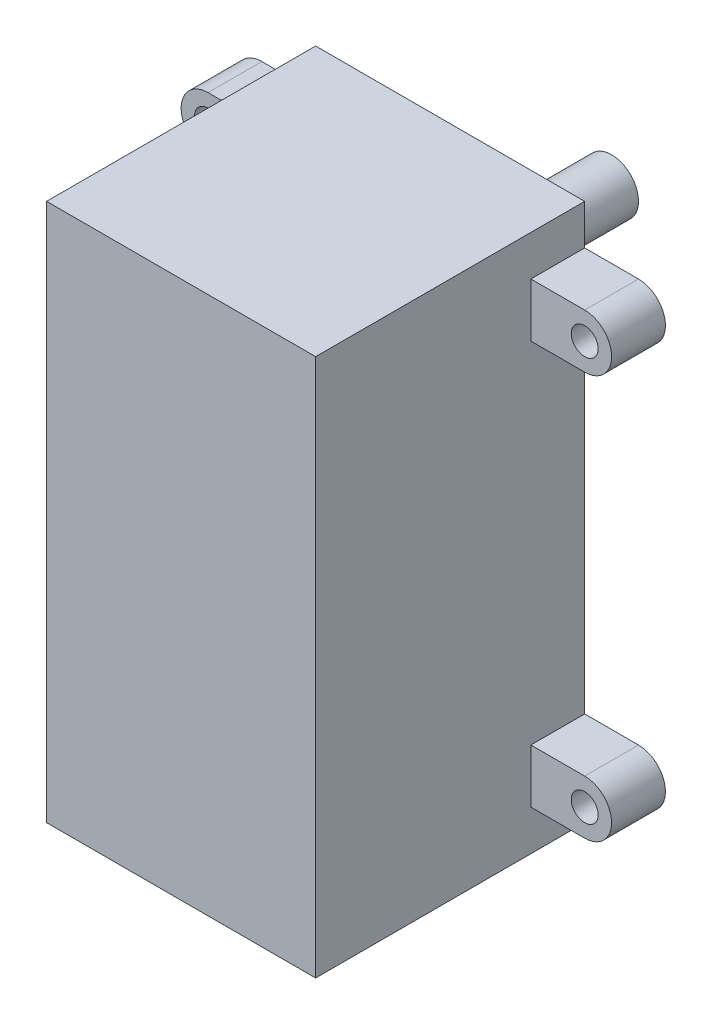
ISO-10303-21;
HEADER;
FILE_DESCRIPTION(('STEP AP214'),'2;1');
FILE_NAME('part.step','',(''),(''),'','','');
FILE_SCHEMA(('AUTOMOTIVE_DESIGN { 1 0 10303 214 1 1 1 1 }'));
ENDSEC;
DATA;
#1=APPLICATION_CONTEXT('core data for automotive mechanical design processes');
#2=APPLICATION_PROTOCOL_DEFINITION('international standard','automotive_design',2000,#1);
#3=PRODUCT_CONTEXT('',#1,'mechanical');
#4=PRODUCT('Part','Part','',(#3));
#5=PRODUCT_RELATED_PRODUCT_CATEGORY('part','',(#4));
#6=PRODUCT_DEFINITION_FORMATION('','',#4);
#7=PRODUCT_DEFINITION_CONTEXT('part definition',#1,'design');
#8=PRODUCT_DEFINITION('design','',#6,#7);
#9=PRODUCT_DEFINITION_SHAPE('','',#8);
#10=(LENGTH_UNIT() NAMED_UNIT(*) SI_UNIT(.MILLI.,.METRE.));
#11=(NAMED_UNIT(*) PLANE_ANGLE_UNIT() SI_UNIT($,.RADIAN.));
#12=(NAMED_UNIT(*) SI_UNIT($,.STERADIAN.) SOLID_ANGLE_UNIT());
#13=UNCERTAINTY_MEASURE_WITH_UNIT(LENGTH_MEASURE(1.E-05),#10,'distance_accuracy_value','');
#14=(GEOMETRIC_REPRESENTATION_CONTEXT(3) GLOBAL_UNCERTAINTY_ASSIGNED_CONTEXT((#13)) GLOBAL_UNIT_ASSIGNED_CONTEXT((#10,
#11,#12)) REPRESENTATION_CONTEXT('',''));
#15=CARTESIAN_POINT('',(0.,0.,0.));
#16=DIRECTION('',(0.,0.,1.));
#17=DIRECTION('',(1.,0.,0.));
#18=AXIS2_PLACEMENT_3D('',#15,#16,#17);
#19=CARTESIAN_POINT('',(-3.29383886255924,-5.,50.));
#20=DIRECTION('',(1.,0.,0.));
#21=DIRECTION('',(0.,0.,-1.));
#22=AXIS2_PLACEMENT_3D('',#19,#20,#21);
#23=PLANE('',#22);
#24=DIRECTION('',(0.,0.,-1.));
#25=VECTOR('',#24,1.);
#26=CARTESIAN_POINT('',(-3.29383886255924,87.5,10.));
#27=LINE('',#26,#25);
#28=CARTESIAN_POINT('',(-3.29383886255924,87.5,10.));
#29=VERTEX_POINT('',#28);
#30=CARTESIAN_POINT('',(-3.29383886255924,87.5,0.));
#31=VERTEX_POINT('',#30);
#32=EDGE_CURVE('E372',#29,#31,#27,.T.);
#33=ORIENTED_EDGE('',*,*,#32,.F.);
#34=DIRECTION('',(0.,-1.,0.));
#35=VECTOR('',#34,1.);
#36=CARTESIAN_POINT('',(-3.29383886255924,77.5,10.));
#37=LINE('',#36,#35);
#38=CARTESIAN_POINT('',(-3.29383886255924,77.5,10.));
#39=VERTEX_POINT('',#38);
#40=EDGE_CURVE('E214',#29,#39,#37,.T.);
#41=ORIENTED_EDGE('',*,*,#40,.T.);
#42=DIRECTION('',(0.,0.,-1.));
#43=VECTOR('',#42,1.);
#44=CARTESIAN_POINT('',(-3.29383886255924,77.5,10.));
#45=LINE('',#44,#43);
#46=CARTESIAN_POINT('',(-3.29383886255924,77.5,0.));
#47=VERTEX_POINT('',#46);
#48=EDGE_CURVE('E189',#39,#47,#45,.T.);
#49=ORIENTED_EDGE('',*,*,#48,.T.);
#50=DIRECTION('',(0.,-1.,0.));
#51=VECTOR('',#50,1.);
#52=CARTESIAN_POINT('',(-3.29383886255924,-5.,0.));
#53=LINE('',#52,#51);
#54=CARTESIAN_POINT('',(-3.29383886255924,12.5,0.));
#55=VERTEX_POINT('',#54);
#56=EDGE_CURVE('E206',#47,#55,#53,.T.);
#57=ORIENTED_EDGE('',*,*,#56,.T.);
#58=DIRECTION('',(0.,0.,-1.));
#59=VECTOR('',#58,1.);
#60=CARTESIAN_POINT('',(-3.29383886255924,12.5,10.));
#61=LINE('',#60,#59);
#62=CARTESIAN_POINT('',(-3.29383886255924,12.5,10.));
#63=VERTEX_POINT('',#62);
#64=EDGE_CURVE('E325',#63,#55,#61,.T.);
#65=ORIENTED_EDGE('',*,*,#64,.F.);
#66=DIRECTION('',(0.,-1.,0.));
#67=VECTOR('',#66,1.);
#68=CARTESIAN_POINT('',(-3.29383886255924,12.5,10.));
#69=LINE('',#68,#67);
#70=CARTESIAN_POINT('',(-3.29383886255924,2.5,10.));
#71=VERTEX_POINT('',#70);
#72=EDGE_CURVE('E304',#63,#71,#69,.T.);
#73=ORIENTED_EDGE('',*,*,#72,.T.);
#74=DIRECTION('',(0.,0.,-1.));
#75=VECTOR('',#74,1.);
#76=CARTESIAN_POINT('',(-3.29383886255924,2.5,10.));
#77=LINE('',#76,#75);
#78=CARTESIAN_POINT('',(-3.29383886255924,2.5,0.));
#79=VERTEX_POINT('',#78);
#80=EDGE_CURVE('E316',#71,#79,#77,.T.);
#81=ORIENTED_EDGE('',*,*,#80,.T.);
#82=CARTESIAN_POINT('',(-3.29383886255924,-5.,0.));
#83=VERTEX_POINT('',#82);
#84=EDGE_CURVE('E344',#79,#83,#53,.T.);
#85=ORIENTED_EDGE('',*,*,#84,.T.);
#86=DIRECTION('',(0.,0.,-1.));
#87=VECTOR('',#86,1.);
#88=CARTESIAN_POINT('',(-3.29383886255924,-5.,50.));
#89=LINE('',#88,#87);
#90=CARTESIAN_POINT('',(-3.29383886255924,-5.,50.));
#91=VERTEX_POINT('',#90);
#92=EDGE_CURVE('E357',#91,#83,#89,.T.);
#93=ORIENTED_EDGE('',*,*,#92,.F.);
#94=DIRECTION('',(0.,-1.,0.));
#95=VECTOR('',#94,1.);
#96=CARTESIAN_POINT('',(-3.29383886255924,-5.,50.));
#97=LINE('',#96,#95);
#98=CARTESIAN_POINT('',(-3.29383886255924,95.,50.));
#99=VERTEX_POINT('',#98);
#100=EDGE_CURVE('E334',#99,#91,#97,.T.);
#101=ORIENTED_EDGE('',*,*,#100,.F.);
#102=DIRECTION('',(0.,0.,-1.));
#103=VECTOR('',#102,1.);
#104=CARTESIAN_POINT('',(-3.29383886255924,95.,50.));
#105=LINE('',#104,#103);
#106=CARTESIAN_POINT('',(-3.29383886255924,95.,0.));
#107=VERTEX_POINT('',#106);
#108=EDGE_CURVE('E50',#99,#107,#105,.T.);
#109=ORIENTED_EDGE('',*,*,#108,.T.);
#110=EDGE_CURVE('E343',#107,#31,#53,.T.);
#111=ORIENTED_EDGE('',*,*,#110,.T.);
#112=EDGE_LOOP('',(#33,#41,#49,#57,#65,#73,#81,#85,#93,#101,#109,#111));
#113=FACE_BOUND('',#112,.T.);
#114=ADVANCED_FACE('F43',(#113),#23,.F.);
#115=CARTESIAN_POINT('',(46.7061611374408,-5.,50.));
#116=DIRECTION('',(-1.,0.,0.));
#117=DIRECTION('',(0.,0.,1.));
#118=AXIS2_PLACEMENT_3D('',#115,#116,#117);
#119=PLANE('',#118);
#120=DIRECTION('',(0.,0.,-1.));
#121=VECTOR('',#120,1.);
#122=CARTESIAN_POINT('',(46.7061611374408,2.5,10.));
#123=LINE('',#122,#121);
#124=CARTESIAN_POINT('',(46.7061611374408,2.5,10.));
#125=VERTEX_POINT('',#124);
#126=CARTESIAN_POINT('',(46.7061611374408,2.5,0.));
#127=VERTEX_POINT('',#126);
#128=EDGE_CURVE('E264',#125,#127,#123,.T.);
#129=ORIENTED_EDGE('',*,*,#128,.F.);
#130=DIRECTION('',(0.,1.,0.));
#131=VECTOR('',#130,1.);
#132=CARTESIAN_POINT('',(46.7061611374408,12.5,10.));
#133=LINE('',#132,#131);
#134=CARTESIAN_POINT('',(46.7061611374408,12.5,10.));
#135=VERTEX_POINT('',#134);
#136=EDGE_CURVE('E286',#125,#135,#133,.T.);
#137=ORIENTED_EDGE('',*,*,#136,.T.);
#138=DIRECTION('',(0.,0.,-1.));
#139=VECTOR('',#138,1.);
#140=CARTESIAN_POINT('',(46.7061611374408,12.5,10.));
#141=LINE('',#140,#139);
#142=CARTESIAN_POINT('',(46.7061611374408,12.5,0.));
#143=VERTEX_POINT('',#142);
#144=EDGE_CURVE('E270',#135,#143,#141,.T.);
#145=ORIENTED_EDGE('',*,*,#144,.T.);
#146=DIRECTION('',(0.,1.,0.));
#147=VECTOR('',#146,1.);
#148=CARTESIAN_POINT('',(46.7061611374408,-5.,0.));
#149=LINE('',#148,#147);
#150=CARTESIAN_POINT('',(46.7061611374408,77.5,0.));
#151=VERTEX_POINT('',#150);
#152=EDGE_CURVE('E354',#143,#151,#149,.T.);
#153=ORIENTED_EDGE('',*,*,#152,.T.);
#154=DIRECTION('',(0.,0.,-1.));
#155=VECTOR('',#154,1.);
#156=CARTESIAN_POINT('',(46.7061611374408,77.5,10.));
#157=LINE('',#156,#155);
#158=CARTESIAN_POINT('',(46.7061611374408,77.5,10.));
#159=VERTEX_POINT('',#158);
#160=EDGE_CURVE('E226',#159,#151,#157,.T.);
#161=ORIENTED_EDGE('',*,*,#160,.F.);
#162=DIRECTION('',(0.,1.,0.));
#163=VECTOR('',#162,1.);
#164=CARTESIAN_POINT('',(46.7061611374408,77.5,10.));
#165=LINE('',#164,#163);
#166=CARTESIAN_POINT('',(46.7061611374408,87.5,10.));
#167=VERTEX_POINT('',#166);
#168=EDGE_CURVE('E250',#159,#167,#165,.T.);
#169=ORIENTED_EDGE('',*,*,#168,.T.);
#170=DIRECTION('',(0.,0.,-1.));
#171=VECTOR('',#170,1.);
#172=CARTESIAN_POINT('',(46.7061611374408,87.5,10.));
#173=LINE('',#172,#171);
#174=CARTESIAN_POINT('',(46.7061611374408,87.5,0.));
#175=VERTEX_POINT('',#174);
#176=EDGE_CURVE('E231',#167,#175,#173,.T.);
#177=ORIENTED_EDGE('',*,*,#176,.T.);
#178=CARTESIAN_POINT('',(46.7061611374408,95.,0.));
#179=VERTEX_POINT('',#178);
#180=EDGE_CURVE('E349',#175,#179,#149,.T.);
#181=ORIENTED_EDGE('',*,*,#180,.T.);
#182=DIRECTION('',(0.,0.,-1.));
#183=VECTOR('',#182,1.);
#184=CARTESIAN_POINT('',(46.7061611374408,95.,50.));
#185=LINE('',#184,#183);
#186=CARTESIAN_POINT('',(46.7061611374408,95.,50.));
#187=VERTEX_POINT('',#186);
#188=EDGE_CURVE('E338',#187,#179,#185,.T.);
#189=ORIENTED_EDGE('',*,*,#188,.F.);
#190=DIRECTION('',(0.,1.,0.));
#191=VECTOR('',#190,1.);
#192=CARTESIAN_POINT('',(46.7061611374408,-5.,50.));
#193=LINE('',#192,#191);
#194=CARTESIAN_POINT('',(46.7061611374408,-5.,50.));
#195=VERTEX_POINT('',#194);
#196=EDGE_CURVE('E340',#195,#187,#193,.T.);
#197=ORIENTED_EDGE('',*,*,#196,.F.);
#198=DIRECTION('',(0.,0.,-1.));
#199=VECTOR('',#198,1.);
#200=CARTESIAN_POINT('',(46.7061611374408,-5.,50.));
#201=LINE('',#200,#199);
#202=CARTESIAN_POINT('',(46.7061611374408,-5.,0.));
#203=VERTEX_POINT('',#202);
#204=EDGE_CURVE('E353',#195,#203,#201,.T.);
#205=ORIENTED_EDGE('',*,*,#204,.T.);
#206=EDGE_CURVE('E331',#203,#127,#149,.T.);
#207=ORIENTED_EDGE('',*,*,#206,.T.);
#208=EDGE_LOOP('',(#129,#137,#145,#153,#161,#169,#177,#181,#189,#197,#205,#207));
#209=FACE_BOUND('',#208,.T.);
#210=ADVANCED_FACE('F410',(#209),#119,.F.);
#211=CARTESIAN_POINT('',(46.7061611374408,95.,50.));
#212=DIRECTION('',(0.,-1.,0.));
#213=DIRECTION('',(0.,0.,-1.));
#214=AXIS2_PLACEMENT_3D('',#211,#212,#213);
#215=PLANE('',#214);
#216=DIRECTION('',(-1.,0.,0.));
#217=VECTOR('',#216,1.);
#218=CARTESIAN_POINT('',(46.7061611374408,95.,0.));
#219=LINE('',#218,#217);
#220=EDGE_CURVE('E322',#179,#107,#219,.T.);
#221=ORIENTED_EDGE('',*,*,#220,.T.);
#222=ORIENTED_EDGE('',*,*,#108,.F.);
#223=DIRECTION('',(-1.,0.,0.));
#224=VECTOR('',#223,1.);
#225=CARTESIAN_POINT('',(46.7061611374408,95.,50.));
#226=LINE('',#225,#224);
#227=EDGE_CURVE('E329',#187,#99,#226,.T.);
#228=ORIENTED_EDGE('',*,*,#227,.F.);
#229=ORIENTED_EDGE('',*,*,#188,.T.);
#230=EDGE_LOOP('',(#221,#222,#228,#229));
#231=FACE_BOUND('',#230,.T.);
#232=ADVANCED_FACE('F44',(#231),#215,.F.);
#233=CARTESIAN_POINT('',(46.7061611374408,-5.,50.));
#234=DIRECTION('',(0.,1.,0.));
#235=DIRECTION('',(0.,0.,1.));
#236=AXIS2_PLACEMENT_3D('',#233,#234,#235);
#237=PLANE('',#236);
#238=DIRECTION('',(1.,0.,0.));
#239=VECTOR('',#238,1.);
#240=CARTESIAN_POINT('',(46.7061611374408,-5.,0.));
#241=LINE('',#240,#239);
#242=EDGE_CURVE('E350',#83,#203,#241,.T.);
#243=ORIENTED_EDGE('',*,*,#242,.T.);
#244=ORIENTED_EDGE('',*,*,#204,.F.);
#245=DIRECTION('',(1.,0.,0.));
#246=VECTOR('',#245,1.);
#247=CARTESIAN_POINT('',(46.7061611374408,-5.,50.));
#248=LINE('',#247,#246);
#249=EDGE_CURVE('E337',#91,#195,#248,.T.);
#250=ORIENTED_EDGE('',*,*,#249,.F.);
#251=ORIENTED_EDGE('',*,*,#92,.T.);
#252=EDGE_LOOP('',(#243,#244,#250,#251));
#253=FACE_BOUND('',#252,.T.);
#254=ADVANCED_FACE('F401',(#253),#237,.F.);
#255=CARTESIAN_POINT('',(0.,0.,50.));
#256=DIRECTION('',(0.,0.,-1.));
#257=DIRECTION('',(-1.,0.,0.));
#258=AXIS2_PLACEMENT_3D('',#255,#256,#257);
#259=PLANE('',#258);
#260=ORIENTED_EDGE('',*,*,#227,.T.);
#261=ORIENTED_EDGE('',*,*,#100,.T.);
#262=ORIENTED_EDGE('',*,*,#249,.T.);
#263=ORIENTED_EDGE('',*,*,#196,.T.);
#264=EDGE_LOOP('',(#260,#261,#262,#263));
#265=FACE_BOUND('',#264,.T.);
#266=ADVANCED_FACE('F394',(#265),#259,.F.);
#267=CARTESIAN_POINT('',(0.,0.,0.));
#268=DIRECTION('',(0.,0.,-1.));
#269=DIRECTION('',(-1.,0.,0.));
#270=AXIS2_PLACEMENT_3D('',#267,#268,#269);
#271=PLANE('',#270);
#272=CARTESIAN_POINT('',(21.7061611374408,70.,0.));
#273=DIRECTION('',(0.,0.,-1.));
#274=DIRECTION('',(-1.,0.,0.));
#275=AXIS2_PLACEMENT_3D('',#272,#273,#274);
#276=CIRCLE('',#275,5.);
#277=CARTESIAN_POINT('',(16.7061611374408,70.,0.));
#278=VERTEX_POINT('',#277);
#279=EDGE_CURVE('E11',#278,#278,#276,.T.);
#280=ORIENTED_EDGE('',*,*,#279,.F.);
#281=EDGE_LOOP('',(#280));
#282=FACE_BOUND('',#281,.T.);
#283=ORIENTED_EDGE('',*,*,#220,.F.);
#284=ORIENTED_EDGE('',*,*,#180,.F.);
#285=DIRECTION('',(1.,0.,0.));
#286=VECTOR('',#285,1.);
#287=CARTESIAN_POINT('',(46.7061611374408,87.5,0.));
#288=LINE('',#287,#286);
#289=CARTESIAN_POINT('',(56.7061611374408,87.5,0.));
#290=VERTEX_POINT('',#289);
#291=EDGE_CURVE('E240',#175,#290,#288,.T.);
#292=ORIENTED_EDGE('',*,*,#291,.T.);
#293=CARTESIAN_POINT('',(56.7061611374408,82.5,0.));
#294=DIRECTION('',(0.,0.,-1.));
#295=DIRECTION('',(-1.,0.,0.));
#296=AXIS2_PLACEMENT_3D('',#293,#294,#295);
#297=CIRCLE('',#296,5.);
#298=CARTESIAN_POINT('',(56.7061611374408,77.5,0.));
#299=VERTEX_POINT('',#298);
#300=EDGE_CURVE('E241',#290,#299,#297,.T.);
#301=ORIENTED_EDGE('',*,*,#300,.T.);
#302=DIRECTION('',(-1.,0.,0.));
#303=VECTOR('',#302,1.);
#304=CARTESIAN_POINT('',(56.7061611374408,77.5,0.));
#305=LINE('',#304,#303);
#306=EDGE_CURVE('E238',#299,#151,#305,.T.);
#307=ORIENTED_EDGE('',*,*,#306,.T.);
#308=ORIENTED_EDGE('',*,*,#152,.F.);
#309=DIRECTION('',(1.,0.,0.));
#310=VECTOR('',#309,1.);
#311=CARTESIAN_POINT('',(56.7061611374408,12.5,0.));
#312=LINE('',#311,#310);
#313=CARTESIAN_POINT('',(56.7061611374408,12.5,0.));
#314=VERTEX_POINT('',#313);
#315=EDGE_CURVE('E272',#143,#314,#312,.T.);
#316=ORIENTED_EDGE('',*,*,#315,.T.);
#317=CARTESIAN_POINT('',(56.7061611374408,7.5,0.));
#318=DIRECTION('',(0.,0.,-1.));
#319=DIRECTION('',(1.,0.,0.));
#320=AXIS2_PLACEMENT_3D('',#317,#318,#319);
#321=CIRCLE('',#320,5.);
#322=CARTESIAN_POINT('',(56.7061611374408,2.5,0.));
#323=VERTEX_POINT('',#322);
#324=EDGE_CURVE('E278',#314,#323,#321,.T.);
#325=ORIENTED_EDGE('',*,*,#324,.T.);
#326=DIRECTION('',(-1.,0.,0.));
#327=VECTOR('',#326,1.);
#328=CARTESIAN_POINT('',(46.7061611374408,2.5,0.));
#329=LINE('',#328,#327);
#330=EDGE_CURVE('E277',#323,#127,#329,.T.);
#331=ORIENTED_EDGE('',*,*,#330,.T.);
#332=ORIENTED_EDGE('',*,*,#206,.F.);
#333=ORIENTED_EDGE('',*,*,#242,.F.);
#334=ORIENTED_EDGE('',*,*,#84,.F.);
#335=DIRECTION('',(-1.,0.,0.));
#336=VECTOR('',#335,1.);
#337=CARTESIAN_POINT('',(-3.29383886255924,2.5,0.));
#338=LINE('',#337,#336);
#339=CARTESIAN_POINT('',(-13.2938388625592,2.5,0.));
#340=VERTEX_POINT('',#339);
#341=EDGE_CURVE('E56',#79,#340,#338,.T.);
#342=ORIENTED_EDGE('',*,*,#341,.T.);
#343=CARTESIAN_POINT('',(-13.2938388625592,7.5,0.));
#344=DIRECTION('',(0.,0.,-1.));
#345=DIRECTION('',(-1.,0.,0.));
#346=AXIS2_PLACEMENT_3D('',#343,#344,#345);
#347=CIRCLE('',#346,5.);
#348=CARTESIAN_POINT('',(-13.2938388625592,12.5,0.));
#349=VERTEX_POINT('',#348);
#350=EDGE_CURVE('E318',#340,#349,#347,.T.);
#351=ORIENTED_EDGE('',*,*,#350,.T.);
#352=DIRECTION('',(1.,0.,0.));
#353=VECTOR('',#352,1.);
#354=CARTESIAN_POINT('',(-13.2938388625592,12.5,0.));
#355=LINE('',#354,#353);
#356=EDGE_CURVE('E307',#349,#55,#355,.T.);
#357=ORIENTED_EDGE('',*,*,#356,.T.);
#358=ORIENTED_EDGE('',*,*,#56,.F.);
#359=DIRECTION('',(-1.,0.,0.));
#360=VECTOR('',#359,1.);
#361=CARTESIAN_POINT('',(-13.2938388625592,77.5,0.));
#362=LINE('',#361,#360);
#363=CARTESIAN_POINT('',(-13.2938388625592,77.5,0.));
#364=VERTEX_POINT('',#363);
#365=EDGE_CURVE('E67',#47,#364,#362,.T.);
#366=ORIENTED_EDGE('',*,*,#365,.T.);
#367=CARTESIAN_POINT('',(-13.2938388625592,82.5,0.));
#368=DIRECTION('',(0.,0.,-1.));
#369=DIRECTION('',(1.,0.,0.));
#370=AXIS2_PLACEMENT_3D('',#367,#368,#369);
#371=CIRCLE('',#370,5.);
#372=CARTESIAN_POINT('',(-13.2938388625592,87.5,0.));
#373=VERTEX_POINT('',#372);
#374=EDGE_CURVE('E191',#364,#373,#371,.T.);
#375=ORIENTED_EDGE('',*,*,#374,.T.);
#376=DIRECTION('',(1.,0.,0.));
#377=VECTOR('',#376,1.);
#378=CARTESIAN_POINT('',(-3.29383886255924,87.5,0.));
#379=LINE('',#378,#377);
#380=EDGE_CURVE('E196',#373,#31,#379,.T.);
#381=ORIENTED_EDGE('',*,*,#380,.T.);
#382=ORIENTED_EDGE('',*,*,#110,.F.);
#383=EDGE_LOOP('',(#283,#284,#292,#301,#307,#308,#316,#325,#331,#332,#333,#334,#342,#351,#357,
#358,#366,#375,#381,#382));
#384=FACE_BOUND('',#383,.T.);
#385=CARTESIAN_POINT('',(56.7061611374408,82.5,0.));
#386=DIRECTION('',(0.,0.,-1.));
#387=DIRECTION('',(-1.,0.,0.));
#388=AXIS2_PLACEMENT_3D('',#385,#386,#387);
#389=CIRCLE('',#388,2.5);
#390=CARTESIAN_POINT('',(54.2061611374408,82.5,0.));
#391=VERTEX_POINT('',#390);
#392=EDGE_CURVE('E190',#391,#391,#389,.T.);
#393=ORIENTED_EDGE('',*,*,#392,.F.);
#394=EDGE_LOOP('',(#393));
#395=FACE_BOUND('',#394,.T.);
#396=CARTESIAN_POINT('',(56.7061611374408,7.5,0.));
#397=DIRECTION('',(0.,0.,-1.));
#398=DIRECTION('',(1.,0.,0.));
#399=AXIS2_PLACEMENT_3D('',#396,#397,#398);
#400=CIRCLE('',#399,2.5);
#401=CARTESIAN_POINT('',(59.2061611374408,7.5,0.));
#402=VERTEX_POINT('',#401);
#403=EDGE_CURVE('E237',#402,#402,#400,.T.);
#404=ORIENTED_EDGE('',*,*,#403,.F.);
#405=EDGE_LOOP('',(#404));
#406=FACE_BOUND('',#405,.T.);
#407=CARTESIAN_POINT('',(-13.2938388625592,7.5,0.));
#408=DIRECTION('',(0.,0.,-1.));
#409=DIRECTION('',(-1.,0.,0.));
#410=AXIS2_PLACEMENT_3D('',#407,#408,#409);
#411=CIRCLE('',#410,2.5);
#412=CARTESIAN_POINT('',(-15.7938388625592,7.5,0.));
#413=VERTEX_POINT('',#412);
#414=EDGE_CURVE('E224',#413,#413,#411,.T.);
#415=ORIENTED_EDGE('',*,*,#414,.F.);
#416=EDGE_LOOP('',(#415));
#417=FACE_BOUND('',#416,.T.);
#418=CARTESIAN_POINT('',(-13.2938388625592,82.5,0.));
#419=DIRECTION('',(0.,0.,-1.));
#420=DIRECTION('',(1.,0.,0.));
#421=AXIS2_PLACEMENT_3D('',#418,#419,#420);
#422=CIRCLE('',#421,2.5);
#423=CARTESIAN_POINT('',(-10.7938388625592,82.5,0.));
#424=VERTEX_POINT('',#423);
#425=EDGE_CURVE('E219',#424,#424,#422,.T.);
#426=ORIENTED_EDGE('',*,*,#425,.F.);
#427=EDGE_LOOP('',(#426));
#428=FACE_BOUND('',#427,.T.);
#429=ADVANCED_FACE('F205',(#282,#384,#395,#406,#417,#428),#271,.T.);
#430=CARTESIAN_POINT('',(56.7061611374408,82.5,10.));
#431=DIRECTION('',(0.,0.,-1.));
#432=DIRECTION('',(-1.,0.,0.));
#433=AXIS2_PLACEMENT_3D('',#430,#431,#432);
#434=CYLINDRICAL_SURFACE('',#433,5.);
#435=ORIENTED_EDGE('',*,*,#300,.F.);
#436=DIRECTION('',(0.,0.,-1.));
#437=VECTOR('',#436,1.);
#438=CARTESIAN_POINT('',(56.7061611374408,87.5,10.));
#439=LINE('',#438,#437);
#440=CARTESIAN_POINT('',(56.7061611374408,87.5,10.));
#441=VERTEX_POINT('',#440);
#442=EDGE_CURVE('E233',#441,#290,#439,.T.);
#443=ORIENTED_EDGE('',*,*,#442,.F.);
#444=CARTESIAN_POINT('',(56.7061611374408,82.5,10.));
#445=DIRECTION('',(0.,0.,-1.));
#446=DIRECTION('',(-1.,0.,0.));
#447=AXIS2_PLACEMENT_3D('',#444,#445,#446);
#448=CIRCLE('',#447,5.);
#449=CARTESIAN_POINT('',(56.7061611374408,77.5,10.));
#450=VERTEX_POINT('',#449);
#451=EDGE_CURVE('E242',#441,#450,#448,.T.);
#452=ORIENTED_EDGE('',*,*,#451,.T.);
#453=DIRECTION('',(0.,0.,-1.));
#454=VECTOR('',#453,1.);
#455=CARTESIAN_POINT('',(56.7061611374408,77.5,10.));
#456=LINE('',#455,#454);
#457=EDGE_CURVE('E227',#450,#299,#456,.T.);
#458=ORIENTED_EDGE('',*,*,#457,.T.);
#459=EDGE_LOOP('',(#435,#443,#452,#458));
#460=FACE_BOUND('',#459,.T.);
#461=ADVANCED_FACE('F392',(#460),#434,.T.);
#462=CARTESIAN_POINT('',(46.7061611374408,87.5,10.));
#463=DIRECTION('',(0.,1.,0.));
#464=DIRECTION('',(0.,0.,1.));
#465=AXIS2_PLACEMENT_3D('',#462,#463,#464);
#466=PLANE('',#465);
#467=ORIENTED_EDGE('',*,*,#291,.F.);
#468=ORIENTED_EDGE('',*,*,#176,.F.);
#469=DIRECTION('',(1.,0.,0.));
#470=VECTOR('',#469,1.);
#471=CARTESIAN_POINT('',(46.7061611374408,87.5,10.));
#472=LINE('',#471,#470);
#473=EDGE_CURVE('E230',#167,#441,#472,.T.);
#474=ORIENTED_EDGE('',*,*,#473,.T.);
#475=ORIENTED_EDGE('',*,*,#442,.T.);
#476=EDGE_LOOP('',(#467,#468,#474,#475));
#477=FACE_BOUND('',#476,.T.);
#478=ADVANCED_FACE('F398',(#477),#466,.T.);
#479=CARTESIAN_POINT('',(56.7061611374408,77.5,10.));
#480=DIRECTION('',(0.,-1.,0.));
#481=DIRECTION('',(0.,0.,-1.));
#482=AXIS2_PLACEMENT_3D('',#479,#480,#481);
#483=PLANE('',#482);
#484=ORIENTED_EDGE('',*,*,#306,.F.);
#485=ORIENTED_EDGE('',*,*,#457,.F.);
#486=DIRECTION('',(-1.,0.,0.));
#487=VECTOR('',#486,1.);
#488=CARTESIAN_POINT('',(56.7061611374408,77.5,10.));
#489=LINE('',#488,#487);
#490=EDGE_CURVE('E251',#450,#159,#489,.T.);
#491=ORIENTED_EDGE('',*,*,#490,.T.);
#492=ORIENTED_EDGE('',*,*,#160,.T.);
#493=EDGE_LOOP('',(#484,#485,#491,#492));
#494=FACE_BOUND('',#493,.T.);
#495=ADVANCED_FACE('F447',(#494),#483,.T.);
#496=CARTESIAN_POINT('',(56.7061611374408,82.5,10.));
#497=DIRECTION('',(0.,0.,-1.));
#498=DIRECTION('',(-1.,0.,0.));
#499=AXIS2_PLACEMENT_3D('',#496,#497,#498);
#500=PLANE('',#499);
#501=CARTESIAN_POINT('',(56.7061611374408,82.5,10.));
#502=DIRECTION('',(0.,0.,-1.));
#503=DIRECTION('',(-1.,0.,0.));
#504=AXIS2_PLACEMENT_3D('',#501,#502,#503);
#505=CIRCLE('',#504,2.5);
#506=CARTESIAN_POINT('',(54.2061611374408,82.5,10.));
#507=VERTEX_POINT('',#506);
#508=EDGE_CURVE('E247',#507,#507,#505,.T.);
#509=ORIENTED_EDGE('',*,*,#508,.T.);
#510=EDGE_LOOP('',(#509));
#511=FACE_BOUND('',#510,.T.);
#512=ORIENTED_EDGE('',*,*,#451,.F.);
#513=ORIENTED_EDGE('',*,*,#473,.F.);
#514=ORIENTED_EDGE('',*,*,#168,.F.);
#515=ORIENTED_EDGE('',*,*,#490,.F.);
#516=EDGE_LOOP('',(#512,#513,#514,#515));
#517=FACE_BOUND('',#516,.T.);
#518=ADVANCED_FACE('F445',(#511,#517),#500,.F.);
#519=CARTESIAN_POINT('',(56.7061611374408,82.5,10.));
#520=DIRECTION('',(0.,0.,-1.));
#521=DIRECTION('',(-1.,0.,0.));
#522=AXIS2_PLACEMENT_3D('',#519,#520,#521);
#523=CYLINDRICAL_SURFACE('',#522,2.5);
#524=ORIENTED_EDGE('',*,*,#508,.F.);
#525=EDGE_LOOP('',(#524));
#526=FACE_BOUND('',#525,.T.);
#527=ORIENTED_EDGE('',*,*,#392,.T.);
#528=EDGE_LOOP('',(#527));
#529=FACE_BOUND('',#528,.T.);
#530=ADVANCED_FACE('F454',(#526,#529),#523,.F.);
#531=CARTESIAN_POINT('',(56.7061611374408,7.5,10.));
#532=DIRECTION('',(0.,0.,-1.));
#533=DIRECTION('',(-1.,0.,0.));
#534=AXIS2_PLACEMENT_3D('',#531,#532,#533);
#535=CYLINDRICAL_SURFACE('',#534,5.);
#536=ORIENTED_EDGE('',*,*,#324,.F.);
#537=DIRECTION('',(0.,0.,-1.));
#538=VECTOR('',#537,1.);
#539=CARTESIAN_POINT('',(56.7061611374408,12.5,10.));
#540=LINE('',#539,#538);
#541=CARTESIAN_POINT('',(56.7061611374408,12.5,10.));
#542=VERTEX_POINT('',#541);
#543=EDGE_CURVE('E269',#542,#314,#540,.T.);
#544=ORIENTED_EDGE('',*,*,#543,.F.);
#545=CARTESIAN_POINT('',(56.7061611374408,7.5,10.));
#546=DIRECTION('',(0.,0.,-1.));
#547=DIRECTION('',(1.,0.,0.));
#548=AXIS2_PLACEMENT_3D('',#545,#546,#547);
#549=CIRCLE('',#548,5.);
#550=CARTESIAN_POINT('',(56.7061611374408,2.5,10.));
#551=VERTEX_POINT('',#550);
#552=EDGE_CURVE('E280',#542,#551,#549,.T.);
#553=ORIENTED_EDGE('',*,*,#552,.T.);
#554=DIRECTION('',(0.,0.,-1.));
#555=VECTOR('',#554,1.);
#556=CARTESIAN_POINT('',(56.7061611374408,2.5,10.));
#557=LINE('',#556,#555);
#558=EDGE_CURVE('E265',#551,#323,#557,.T.);
#559=ORIENTED_EDGE('',*,*,#558,.T.);
#560=EDGE_LOOP('',(#536,#544,#553,#559));
#561=FACE_BOUND('',#560,.T.);
#562=ADVANCED_FACE('F462',(#561),#535,.T.);
#563=CARTESIAN_POINT('',(56.7061611374408,12.5,10.));
#564=DIRECTION('',(0.,1.,0.));
#565=DIRECTION('',(0.,0.,1.));
#566=AXIS2_PLACEMENT_3D('',#563,#564,#565);
#567=PLANE('',#566);
#568=ORIENTED_EDGE('',*,*,#315,.F.);
#569=ORIENTED_EDGE('',*,*,#144,.F.);
#570=DIRECTION('',(1.,0.,0.));
#571=VECTOR('',#570,1.);
#572=CARTESIAN_POINT('',(56.7061611374408,12.5,10.));
#573=LINE('',#572,#571);
#574=EDGE_CURVE('E262',#135,#542,#573,.T.);
#575=ORIENTED_EDGE('',*,*,#574,.T.);
#576=ORIENTED_EDGE('',*,*,#543,.T.);
#577=EDGE_LOOP('',(#568,#569,#575,#576));
#578=FACE_BOUND('',#577,.T.);
#579=ADVANCED_FACE('F434',(#578),#567,.T.);
#580=CARTESIAN_POINT('',(46.7061611374408,2.5,10.));
#581=DIRECTION('',(0.,-1.,0.));
#582=DIRECTION('',(1.,0.,0.));
#583=AXIS2_PLACEMENT_3D('',#580,#581,#582);
#584=PLANE('',#583);
#585=ORIENTED_EDGE('',*,*,#330,.F.);
#586=ORIENTED_EDGE('',*,*,#558,.F.);
#587=DIRECTION('',(-1.,0.,0.));
#588=VECTOR('',#587,1.);
#589=CARTESIAN_POINT('',(46.7061611374408,2.5,10.));
#590=LINE('',#589,#588);
#591=EDGE_CURVE('E288',#551,#125,#590,.T.);
#592=ORIENTED_EDGE('',*,*,#591,.T.);
#593=ORIENTED_EDGE('',*,*,#128,.T.);
#594=EDGE_LOOP('',(#585,#586,#592,#593));
#595=FACE_BOUND('',#594,.T.);
#596=ADVANCED_FACE('F426',(#595),#584,.T.);
#597=CARTESIAN_POINT('',(56.7061611374408,7.5,10.));
#598=DIRECTION('',(0.,0.,1.));
#599=DIRECTION('',(1.,0.,0.));
#600=AXIS2_PLACEMENT_3D('',#597,#598,#599);
#601=PLANE('',#600);
#602=CARTESIAN_POINT('',(56.7061611374408,7.5,10.));
#603=DIRECTION('',(0.,0.,-1.));
#604=DIRECTION('',(1.,0.,0.));
#605=AXIS2_PLACEMENT_3D('',#602,#603,#604);
#606=CIRCLE('',#605,2.5);
#607=CARTESIAN_POINT('',(59.2061611374408,7.5,10.));
#608=VERTEX_POINT('',#607);
#609=EDGE_CURVE('E285',#608,#608,#606,.T.);
#610=ORIENTED_EDGE('',*,*,#609,.T.);
#611=EDGE_LOOP('',(#610));
#612=FACE_BOUND('',#611,.T.);
#613=ORIENTED_EDGE('',*,*,#552,.F.);
#614=ORIENTED_EDGE('',*,*,#574,.F.);
#615=ORIENTED_EDGE('',*,*,#136,.F.);
#616=ORIENTED_EDGE('',*,*,#591,.F.);
#617=EDGE_LOOP('',(#613,#614,#615,#616));
#618=FACE_BOUND('',#617,.T.);
#619=ADVANCED_FACE('F433',(#612,#618),#601,.T.);
#620=CARTESIAN_POINT('',(56.7061611374408,7.5,10.));
#621=DIRECTION('',(0.,0.,-1.));
#622=DIRECTION('',(-1.,0.,0.));
#623=AXIS2_PLACEMENT_3D('',#620,#621,#622);
#624=CYLINDRICAL_SURFACE('',#623,2.5);
#625=ORIENTED_EDGE('',*,*,#609,.F.);
#626=EDGE_LOOP('',(#625));
#627=FACE_BOUND('',#626,.T.);
#628=ORIENTED_EDGE('',*,*,#403,.T.);
#629=EDGE_LOOP('',(#628));
#630=FACE_BOUND('',#629,.T.);
#631=ADVANCED_FACE('F472',(#627,#630),#624,.F.);
#632=CARTESIAN_POINT('',(-13.2938388625592,12.5,10.));
#633=DIRECTION('',(0.,1.,0.));
#634=DIRECTION('',(0.,0.,1.));
#635=AXIS2_PLACEMENT_3D('',#632,#633,#634);
#636=PLANE('',#635);
#637=ORIENTED_EDGE('',*,*,#356,.F.);
#638=DIRECTION('',(0.,0.,-1.));
#639=VECTOR('',#638,1.);
#640=CARTESIAN_POINT('',(-13.2938388625592,12.5,10.));
#641=LINE('',#640,#639);
#642=CARTESIAN_POINT('',(-13.2938388625592,12.5,10.));
#643=VERTEX_POINT('',#642);
#644=EDGE_CURVE('E324',#643,#349,#641,.T.);
#645=ORIENTED_EDGE('',*,*,#644,.F.);
#646=DIRECTION('',(1.,0.,0.));
#647=VECTOR('',#646,1.);
#648=CARTESIAN_POINT('',(-13.2938388625592,12.5,10.));
#649=LINE('',#648,#647);
#650=EDGE_CURVE('E311',#643,#63,#649,.T.);
#651=ORIENTED_EDGE('',*,*,#650,.T.);
#652=ORIENTED_EDGE('',*,*,#64,.T.);
#653=EDGE_LOOP('',(#637,#645,#651,#652));
#654=FACE_BOUND('',#653,.T.);
#655=ADVANCED_FACE('F478',(#654),#636,.T.);
#656=CARTESIAN_POINT('',(-13.2938388625592,7.5,10.));
#657=DIRECTION('',(0.,0.,-1.));
#658=DIRECTION('',(-1.,0.,0.));
#659=AXIS2_PLACEMENT_3D('',#656,#657,#658);
#660=CYLINDRICAL_SURFACE('',#659,5.);
#661=ORIENTED_EDGE('',*,*,#350,.F.);
#662=DIRECTION('',(0.,0.,-1.));
#663=VECTOR('',#662,1.);
#664=CARTESIAN_POINT('',(-13.2938388625592,2.5,10.));
#665=LINE('',#664,#663);
#666=CARTESIAN_POINT('',(-13.2938388625592,2.5,10.));
#667=VERTEX_POINT('',#666);
#668=EDGE_CURVE('E330',#667,#340,#665,.T.);
#669=ORIENTED_EDGE('',*,*,#668,.F.);
#670=CARTESIAN_POINT('',(-13.2938388625592,7.5,10.));
#671=DIRECTION('',(0.,0.,-1.));
#672=DIRECTION('',(-1.,0.,0.));
#673=AXIS2_PLACEMENT_3D('',#670,#671,#672);
#674=CIRCLE('',#673,5.);
#675=EDGE_CURVE('E309',#667,#643,#674,.T.);
#676=ORIENTED_EDGE('',*,*,#675,.T.);
#677=ORIENTED_EDGE('',*,*,#644,.T.);
#678=EDGE_LOOP('',(#661,#669,#676,#677));
#679=FACE_BOUND('',#678,.T.);
#680=ADVANCED_FACE('F487',(#679),#660,.T.);
#681=CARTESIAN_POINT('',(-3.29383886255924,2.5,10.));
#682=DIRECTION('',(0.,-1.,0.));
#683=DIRECTION('',(1.,0.,0.));
#684=AXIS2_PLACEMENT_3D('',#681,#682,#683);
#685=PLANE('',#684);
#686=ORIENTED_EDGE('',*,*,#341,.F.);
#687=ORIENTED_EDGE('',*,*,#80,.F.);
#688=DIRECTION('',(-1.,0.,0.));
#689=VECTOR('',#688,1.);
#690=CARTESIAN_POINT('',(-3.29383886255924,2.5,10.));
#691=LINE('',#690,#689);
#692=EDGE_CURVE('E308',#71,#667,#691,.T.);
#693=ORIENTED_EDGE('',*,*,#692,.T.);
#694=ORIENTED_EDGE('',*,*,#668,.T.);
#695=EDGE_LOOP('',(#686,#687,#693,#694));
#696=FACE_BOUND('',#695,.T.);
#697=ADVANCED_FACE('F484',(#696),#685,.T.);
#698=CARTESIAN_POINT('',(-13.2938388625592,7.5,10.));
#699=DIRECTION('',(0.,0.,-1.));
#700=DIRECTION('',(-1.,0.,0.));
#701=AXIS2_PLACEMENT_3D('',#698,#699,#700);
#702=PLANE('',#701);
#703=CARTESIAN_POINT('',(-13.2938388625592,7.5,10.));
#704=DIRECTION('',(0.,0.,-1.));
#705=DIRECTION('',(-1.,0.,0.));
#706=AXIS2_PLACEMENT_3D('',#703,#704,#705);
#707=CIRCLE('',#706,2.5);
#708=CARTESIAN_POINT('',(-15.7938388625592,7.5,10.));
#709=VERTEX_POINT('',#708);
#710=EDGE_CURVE('E300',#709,#709,#707,.T.);
#711=ORIENTED_EDGE('',*,*,#710,.T.);
#712=EDGE_LOOP('',(#711));
#713=FACE_BOUND('',#712,.T.);
#714=ORIENTED_EDGE('',*,*,#72,.F.);
#715=ORIENTED_EDGE('',*,*,#650,.F.);
#716=ORIENTED_EDGE('',*,*,#675,.F.);
#717=ORIENTED_EDGE('',*,*,#692,.F.);
#718=EDGE_LOOP('',(#714,#715,#716,#717));
#719=FACE_BOUND('',#718,.T.);
#720=ADVANCED_FACE('F481',(#713,#719),#702,.F.);
#721=CARTESIAN_POINT('',(-13.2938388625592,7.5,10.));
#722=DIRECTION('',(0.,0.,-1.));
#723=DIRECTION('',(-1.,0.,0.));
#724=AXIS2_PLACEMENT_3D('',#721,#722,#723);
#725=CYLINDRICAL_SURFACE('',#724,2.5);
#726=ORIENTED_EDGE('',*,*,#710,.F.);
#727=EDGE_LOOP('',(#726));
#728=FACE_BOUND('',#727,.T.);
#729=ORIENTED_EDGE('',*,*,#414,.T.);
#730=EDGE_LOOP('',(#729));
#731=FACE_BOUND('',#730,.T.);
#732=ADVANCED_FACE('F476',(#728,#731),#725,.F.);
#733=CARTESIAN_POINT('',(-13.2938388625592,82.5,10.));
#734=DIRECTION('',(0.,0.,-1.));
#735=DIRECTION('',(-1.,0.,0.));
#736=AXIS2_PLACEMENT_3D('',#733,#734,#735);
#737=CYLINDRICAL_SURFACE('',#736,5.);
#738=ORIENTED_EDGE('',*,*,#374,.F.);
#739=DIRECTION('',(0.,0.,-1.));
#740=VECTOR('',#739,1.);
#741=CARTESIAN_POINT('',(-13.2938388625592,77.5,10.));
#742=LINE('',#741,#740);
#743=CARTESIAN_POINT('',(-13.2938388625592,77.5,10.));
#744=VERTEX_POINT('',#743);
#745=EDGE_CURVE('E178',#744,#364,#742,.T.);
#746=ORIENTED_EDGE('',*,*,#745,.F.);
#747=CARTESIAN_POINT('',(-13.2938388625592,82.5,10.));
#748=DIRECTION('',(0.,0.,-1.));
#749=DIRECTION('',(1.,0.,0.));
#750=AXIS2_PLACEMENT_3D('',#747,#748,#749);
#751=CIRCLE('',#750,5.);
#752=CARTESIAN_POINT('',(-13.2938388625592,87.5,10.));
#753=VERTEX_POINT('',#752);
#754=EDGE_CURVE('E210',#744,#753,#751,.T.);
#755=ORIENTED_EDGE('',*,*,#754,.T.);
#756=DIRECTION('',(0.,0.,-1.));
#757=VECTOR('',#756,1.);
#758=CARTESIAN_POINT('',(-13.2938388625592,87.5,10.));
#759=LINE('',#758,#757);
#760=EDGE_CURVE('E194',#753,#373,#759,.T.);
#761=ORIENTED_EDGE('',*,*,#760,.T.);
#762=EDGE_LOOP('',(#738,#746,#755,#761));
#763=FACE_BOUND('',#762,.T.);
#764=ADVANCED_FACE('F192',(#763),#737,.T.);
#765=CARTESIAN_POINT('',(-13.2938388625592,77.5,10.));
#766=DIRECTION('',(0.,-1.,0.));
#767=DIRECTION('',(0.,0.,-1.));
#768=AXIS2_PLACEMENT_3D('',#765,#766,#767);
#769=PLANE('',#768);
#770=ORIENTED_EDGE('',*,*,#365,.F.);
#771=ORIENTED_EDGE('',*,*,#48,.F.);
#772=DIRECTION('',(-1.,0.,0.));
#773=VECTOR('',#772,1.);
#774=CARTESIAN_POINT('',(-13.2938388625592,77.5,10.));
#775=LINE('',#774,#773);
#776=EDGE_CURVE('E181',#39,#744,#775,.T.);
#777=ORIENTED_EDGE('',*,*,#776,.T.);
#778=ORIENTED_EDGE('',*,*,#745,.T.);
#779=EDGE_LOOP('',(#770,#771,#777,#778));
#780=FACE_BOUND('',#779,.T.);
#781=ADVANCED_FACE('F182',(#780),#769,.T.);
#782=CARTESIAN_POINT('',(-3.29383886255924,87.5,10.));
#783=DIRECTION('',(0.,1.,0.));
#784=DIRECTION('',(0.,0.,1.));
#785=AXIS2_PLACEMENT_3D('',#782,#783,#784);
#786=PLANE('',#785);
#787=ORIENTED_EDGE('',*,*,#380,.F.);
#788=ORIENTED_EDGE('',*,*,#760,.F.);
#789=DIRECTION('',(1.,0.,0.));
#790=VECTOR('',#789,1.);
#791=CARTESIAN_POINT('',(-3.29383886255924,87.5,10.));
#792=LINE('',#791,#790);
#793=EDGE_CURVE('E209',#753,#29,#792,.T.);
#794=ORIENTED_EDGE('',*,*,#793,.T.);
#795=ORIENTED_EDGE('',*,*,#32,.T.);
#796=EDGE_LOOP('',(#787,#788,#794,#795));
#797=FACE_BOUND('',#796,.T.);
#798=ADVANCED_FACE('F375',(#797),#786,.T.);
#799=CARTESIAN_POINT('',(-13.2938388625592,82.5,10.));
#800=DIRECTION('',(0.,0.,1.));
#801=DIRECTION('',(1.,0.,0.));
#802=AXIS2_PLACEMENT_3D('',#799,#800,#801);
#803=PLANE('',#802);
#804=CARTESIAN_POINT('',(-13.2938388625592,82.5,10.));
#805=DIRECTION('',(0.,0.,-1.));
#806=DIRECTION('',(1.,0.,0.));
#807=AXIS2_PLACEMENT_3D('',#804,#805,#806);
#808=CIRCLE('',#807,2.5);
#809=CARTESIAN_POINT('',(-10.7938388625592,82.5,10.));
#810=VERTEX_POINT('',#809);
#811=EDGE_CURVE('E197',#810,#810,#808,.T.);
#812=ORIENTED_EDGE('',*,*,#811,.T.);
#813=EDGE_LOOP('',(#812));
#814=FACE_BOUND('',#813,.T.);
#815=ORIENTED_EDGE('',*,*,#754,.F.);
#816=ORIENTED_EDGE('',*,*,#776,.F.);
#817=ORIENTED_EDGE('',*,*,#40,.F.);
#818=ORIENTED_EDGE('',*,*,#793,.F.);
#819=EDGE_LOOP('',(#815,#816,#817,#818));
#820=FACE_BOUND('',#819,.T.);
#821=ADVANCED_FACE('F529',(#814,#820),#803,.T.);
#822=CARTESIAN_POINT('',(-13.2938388625592,82.5,10.));
#823=DIRECTION('',(0.,0.,-1.));
#824=DIRECTION('',(-1.,0.,0.));
#825=AXIS2_PLACEMENT_3D('',#822,#823,#824);
#826=CYLINDRICAL_SURFACE('',#825,2.5);
#827=ORIENTED_EDGE('',*,*,#811,.F.);
#828=EDGE_LOOP('',(#827));
#829=FACE_BOUND('',#828,.T.);
#830=ORIENTED_EDGE('',*,*,#425,.T.);
#831=EDGE_LOOP('',(#830));
#832=FACE_BOUND('',#831,.T.);
#833=ADVANCED_FACE('F387',(#829,#832),#826,.F.);
#834=CARTESIAN_POINT('',(21.7061611374408,70.,-30.));
#835=DIRECTION('',(0.,0.,1.));
#836=DIRECTION('',(1.,0.,0.));
#837=AXIS2_PLACEMENT_3D('',#834,#835,#836);
#838=CYLINDRICAL_SURFACE('',#837,5.);
#839=CARTESIAN_POINT('',(21.7061611374408,70.,-30.));
#840=DIRECTION('',(0.,0.,-1.));
#841=DIRECTION('',(-1.,0.,0.));
#842=AXIS2_PLACEMENT_3D('',#839,#840,#841);
#843=CIRCLE('',#842,5.);
#844=CARTESIAN_POINT('',(16.7061611374408,70.,-30.));
#845=VERTEX_POINT('',#844);
#846=EDGE_CURVE('E275',#845,#845,#843,.T.);
#847=ORIENTED_EDGE('',*,*,#846,.F.);
#848=EDGE_LOOP('',(#847));
#849=FACE_BOUND('',#848,.T.);
#850=ORIENTED_EDGE('',*,*,#279,.T.);
#851=EDGE_LOOP('',(#850));
#852=FACE_BOUND('',#851,.T.);
#853=ADVANCED_FACE('F382',(#849,#852),#838,.T.);
#854=CARTESIAN_POINT('',(21.7061611374408,70.,-30.));
#855=DIRECTION('',(0.,0.,-1.));
#856=DIRECTION('',(-1.,0.,0.));
#857=AXIS2_PLACEMENT_3D('',#854,#855,#856);
#858=PLANE('',#857);
#859=ORIENTED_EDGE('',*,*,#846,.T.);
#860=EDGE_LOOP('',(#859));
#861=FACE_BOUND('',#860,.T.);
#862=ADVANCED_FACE('F381',(#861),#858,.T.);
#863=CLOSED_SHELL('',(#114,#210,#232,#254,#266,#429,#461,#478,#495,#518,#530,#562,#579,#596,
#619,#631,#655,#680,#697,#720,#732,#764,#781,#798,#821,#833,#853,#862));
#864=MANIFOLD_SOLID_BREP('B2',#863);
#865=ADVANCED_BREP_SHAPE_REPRESENTATION('',(#18,#864),#14);
#866=SHAPE_DEFINITION_REPRESENTATION(#9,#865);
ENDSEC;
END-ISO-10303-21;
